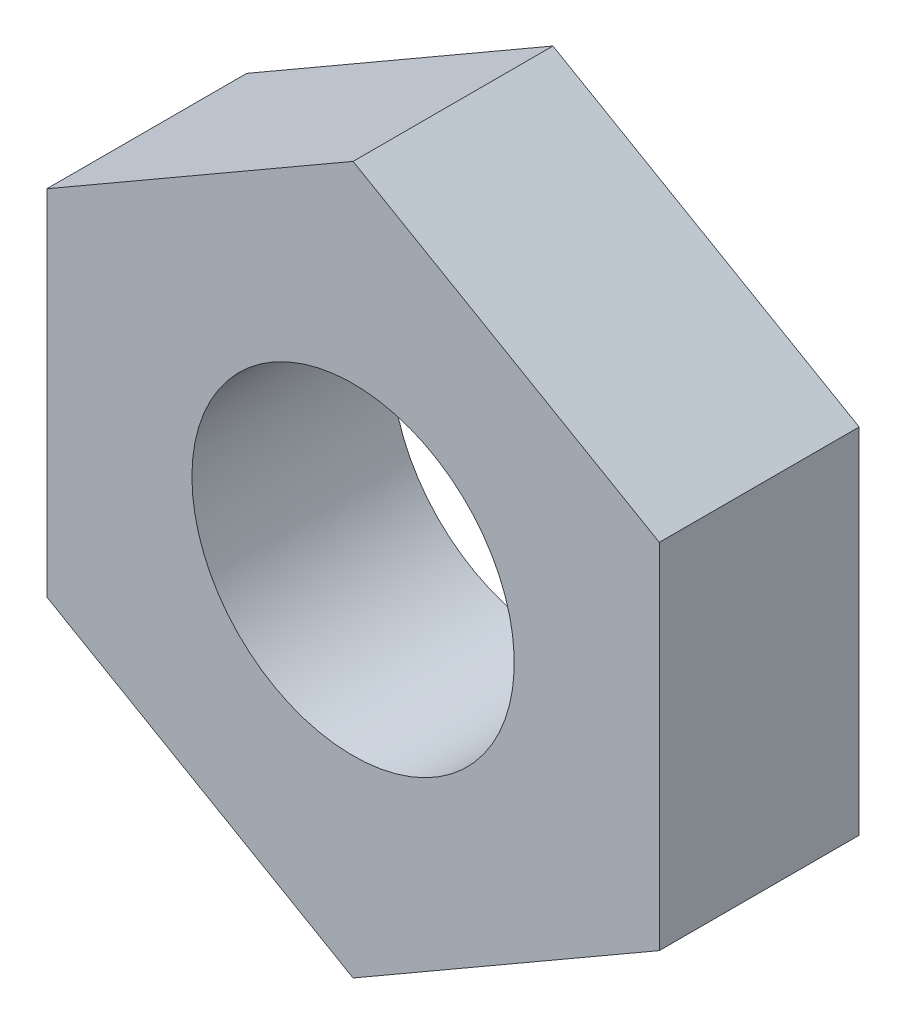
ISO-10303-21;
HEADER;
FILE_DESCRIPTION(('STEP AP214'),'2;1');
FILE_NAME('part.step','',(''),(''),'','','');
FILE_SCHEMA(('AUTOMOTIVE_DESIGN { 1 0 10303 214 1 1 1 1 }'));
ENDSEC;
DATA;
#1=APPLICATION_CONTEXT('core data for automotive mechanical design processes');
#2=APPLICATION_PROTOCOL_DEFINITION('international standard','automotive_design',2000,#1);
#3=PRODUCT_CONTEXT('',#1,'mechanical');
#4=PRODUCT('Part','Part','',(#3));
#5=PRODUCT_RELATED_PRODUCT_CATEGORY('part','',(#4));
#6=PRODUCT_DEFINITION_FORMATION('','',#4);
#7=PRODUCT_DEFINITION_CONTEXT('part definition',#1,'design');
#8=PRODUCT_DEFINITION('design','',#6,#7);
#9=PRODUCT_DEFINITION_SHAPE('','',#8);
#10=(LENGTH_UNIT() NAMED_UNIT(*) SI_UNIT(.MILLI.,.METRE.));
#11=(NAMED_UNIT(*) PLANE_ANGLE_UNIT() SI_UNIT($,.RADIAN.));
#12=(NAMED_UNIT(*) SI_UNIT($,.STERADIAN.) SOLID_ANGLE_UNIT());
#13=UNCERTAINTY_MEASURE_WITH_UNIT(LENGTH_MEASURE(1.E-05),#10,'distance_accuracy_value','');
#14=(GEOMETRIC_REPRESENTATION_CONTEXT(3) GLOBAL_UNCERTAINTY_ASSIGNED_CONTEXT((#13)) GLOBAL_UNIT_ASSIGNED_CONTEXT((#10,
#11,#12)) REPRESENTATION_CONTEXT('',''));
#15=CARTESIAN_POINT('',(0.,0.,0.));
#16=DIRECTION('',(0.,0.,1.));
#17=DIRECTION('',(1.,0.,0.));
#18=AXIS2_PLACEMENT_3D('',#15,#16,#17);
#19=CARTESIAN_POINT('',(0.,0.,3.1));
#20=DIRECTION('',(0.,0.,1.));
#21=DIRECTION('',(1.,0.,0.));
#22=AXIS2_PLACEMENT_3D('',#19,#20,#21);
#23=PLANE('',#22);
#24=DIRECTION('',(0.866025403784441,-0.499999999999996,0.));
#25=VECTOR('',#24,1.);
#26=CARTESIAN_POINT('',(15.25,-22.7424137786508,3.1));
#27=LINE('',#26,#25);
#28=CARTESIAN_POINT('',(15.25,-22.7424137786508,3.1));
#29=VERTEX_POINT('',#28);
#30=CARTESIAN_POINT('',(20.,-25.4848275573014,3.1));
#31=VERTEX_POINT('',#30);
#32=EDGE_CURVE('E134',#29,#31,#27,.T.);
#33=ORIENTED_EDGE('',*,*,#32,.T.);
#34=DIRECTION('',(0.866025403784438,0.500000000000001,0.));
#35=VECTOR('',#34,1.);
#36=CARTESIAN_POINT('',(20.,-25.4848275573014,3.1));
#37=LINE('',#36,#35);
#38=CARTESIAN_POINT('',(24.75,-22.7424137786507,3.1));
#39=VERTEX_POINT('',#38);
#40=EDGE_CURVE('E93',#31,#39,#37,.T.);
#41=ORIENTED_EDGE('',*,*,#40,.T.);
#42=DIRECTION('',(0.,1.,0.));
#43=VECTOR('',#42,1.);
#44=CARTESIAN_POINT('',(24.75,-22.7424137786507,3.1));
#45=LINE('',#44,#43);
#46=CARTESIAN_POINT('',(24.75,-17.2575862213493,3.1));
#47=VERTEX_POINT('',#46);
#48=EDGE_CURVE('E107',#39,#47,#45,.T.);
#49=ORIENTED_EDGE('',*,*,#48,.T.);
#50=DIRECTION('',(-0.866025403784441,0.499999999999996,0.));
#51=VECTOR('',#50,1.);
#52=CARTESIAN_POINT('',(24.75,-17.2575862213493,3.1));
#53=LINE('',#52,#51);
#54=CARTESIAN_POINT('',(20.,-14.5151724426986,3.1));
#55=VERTEX_POINT('',#54);
#56=EDGE_CURVE('E99',#47,#55,#53,.T.);
#57=ORIENTED_EDGE('',*,*,#56,.T.);
#58=DIRECTION('',(-0.866025403784435,-0.500000000000006,0.));
#59=VECTOR('',#58,1.);
#60=CARTESIAN_POINT('',(20.,-14.5151724426986,3.1));
#61=LINE('',#60,#59);
#62=CARTESIAN_POINT('',(15.25,-17.2575862213493,3.1));
#63=VERTEX_POINT('',#62);
#64=EDGE_CURVE('E101',#55,#63,#61,.T.);
#65=ORIENTED_EDGE('',*,*,#64,.T.);
#66=DIRECTION('',(0.,-1.,0.));
#67=VECTOR('',#66,1.);
#68=CARTESIAN_POINT('',(15.25,-17.2575862213493,3.1));
#69=LINE('',#68,#67);
#70=EDGE_CURVE('E57',#63,#29,#69,.T.);
#71=ORIENTED_EDGE('',*,*,#70,.T.);
#72=EDGE_LOOP('',(#33,#41,#49,#57,#65,#71));
#73=FACE_BOUND('',#72,.T.);
#74=CARTESIAN_POINT('',(20.,-20.,3.1));
#75=DIRECTION('',(0.,0.,1.));
#76=DIRECTION('',(1.,0.,0.));
#77=AXIS2_PLACEMENT_3D('',#74,#75,#76);
#78=CIRCLE('',#77,2.5);
#79=CARTESIAN_POINT('',(17.5,-20.,3.1));
#80=VERTEX_POINT('',#79);
#81=EDGE_CURVE('E126',#80,#80,#78,.T.);
#82=ORIENTED_EDGE('',*,*,#81,.F.);
#83=EDGE_LOOP('',(#82));
#84=FACE_BOUND('',#83,.T.);
#85=ADVANCED_FACE('F39',(#73,#84),#23,.T.);
#86=CARTESIAN_POINT('',(0.,0.,0.));
#87=DIRECTION('',(0.,0.,1.));
#88=DIRECTION('',(1.,0.,0.));
#89=AXIS2_PLACEMENT_3D('',#86,#87,#88);
#90=PLANE('',#89);
#91=DIRECTION('',(0.866025403784441,-0.499999999999996,0.));
#92=VECTOR('',#91,1.);
#93=CARTESIAN_POINT('',(15.25,-22.7424137786508,0.));
#94=LINE('',#93,#92);
#95=CARTESIAN_POINT('',(15.25,-22.7424137786508,0.));
#96=VERTEX_POINT('',#95);
#97=CARTESIAN_POINT('',(20.,-25.4848275573014,0.));
#98=VERTEX_POINT('',#97);
#99=EDGE_CURVE('E125',#96,#98,#94,.T.);
#100=ORIENTED_EDGE('',*,*,#99,.F.);
#101=DIRECTION('',(0.,-1.,0.));
#102=VECTOR('',#101,1.);
#103=CARTESIAN_POINT('',(15.25,-17.2575862213493,0.));
#104=LINE('',#103,#102);
#105=CARTESIAN_POINT('',(15.25,-17.2575862213493,0.));
#106=VERTEX_POINT('',#105);
#107=EDGE_CURVE('E82',#106,#96,#104,.T.);
#108=ORIENTED_EDGE('',*,*,#107,.F.);
#109=DIRECTION('',(-0.866025403784435,-0.500000000000006,0.));
#110=VECTOR('',#109,1.);
#111=CARTESIAN_POINT('',(20.,-14.5151724426986,0.));
#112=LINE('',#111,#110);
#113=CARTESIAN_POINT('',(20.,-14.5151724426986,0.));
#114=VERTEX_POINT('',#113);
#115=EDGE_CURVE('E80',#114,#106,#112,.T.);
#116=ORIENTED_EDGE('',*,*,#115,.F.);
#117=DIRECTION('',(-0.866025403784441,0.499999999999996,0.));
#118=VECTOR('',#117,1.);
#119=CARTESIAN_POINT('',(24.75,-17.2575862213493,0.));
#120=LINE('',#119,#118);
#121=CARTESIAN_POINT('',(24.75,-17.2575862213493,0.));
#122=VERTEX_POINT('',#121);
#123=EDGE_CURVE('E114',#122,#114,#120,.T.);
#124=ORIENTED_EDGE('',*,*,#123,.F.);
#125=DIRECTION('',(0.,1.,0.));
#126=VECTOR('',#125,1.);
#127=CARTESIAN_POINT('',(24.75,-22.7424137786507,0.));
#128=LINE('',#127,#126);
#129=CARTESIAN_POINT('',(24.75,-22.7424137786507,0.));
#130=VERTEX_POINT('',#129);
#131=EDGE_CURVE('E127',#130,#122,#128,.T.);
#132=ORIENTED_EDGE('',*,*,#131,.F.);
#133=DIRECTION('',(0.866025403784438,0.500000000000001,0.));
#134=VECTOR('',#133,1.);
#135=CARTESIAN_POINT('',(20.,-25.4848275573014,0.));
#136=LINE('',#135,#134);
#137=EDGE_CURVE('E130',#98,#130,#136,.T.);
#138=ORIENTED_EDGE('',*,*,#137,.F.);
#139=EDGE_LOOP('',(#100,#108,#116,#124,#132,#138));
#140=FACE_BOUND('',#139,.T.);
#141=CARTESIAN_POINT('',(20.,-20.,0.));
#142=DIRECTION('',(0.,0.,1.));
#143=DIRECTION('',(1.,0.,0.));
#144=AXIS2_PLACEMENT_3D('',#141,#142,#143);
#145=CIRCLE('',#144,2.5);
#146=CARTESIAN_POINT('',(17.5,-20.,0.));
#147=VERTEX_POINT('',#146);
#148=EDGE_CURVE('E228',#147,#147,#145,.T.);
#149=ORIENTED_EDGE('',*,*,#148,.T.);
#150=EDGE_LOOP('',(#149));
#151=FACE_BOUND('',#150,.T.);
#152=ADVANCED_FACE('F143',(#140,#151),#90,.F.);
#153=CARTESIAN_POINT('',(15.25,-22.7424137786508,3.1));
#154=DIRECTION('',(0.499999999999996,0.866025403784441,0.));
#155=DIRECTION('',(-0.866025403784441,0.499999999999996,0.));
#156=AXIS2_PLACEMENT_3D('',#153,#154,#155);
#157=PLANE('',#156);
#158=ORIENTED_EDGE('',*,*,#99,.T.);
#159=DIRECTION('',(0.,0.,-1.));
#160=VECTOR('',#159,1.);
#161=CARTESIAN_POINT('',(20.,-25.4848275573014,3.1));
#162=LINE('',#161,#160);
#163=EDGE_CURVE('E11',#31,#98,#162,.T.);
#164=ORIENTED_EDGE('',*,*,#163,.F.);
#165=ORIENTED_EDGE('',*,*,#32,.F.);
#166=DIRECTION('',(0.,0.,-1.));
#167=VECTOR('',#166,1.);
#168=CARTESIAN_POINT('',(15.25,-22.7424137786508,3.1));
#169=LINE('',#168,#167);
#170=EDGE_CURVE('E118',#29,#96,#169,.T.);
#171=ORIENTED_EDGE('',*,*,#170,.T.);
#172=EDGE_LOOP('',(#158,#164,#165,#171));
#173=FACE_BOUND('',#172,.T.);
#174=ADVANCED_FACE('F41',(#173),#157,.F.);
#175=CARTESIAN_POINT('',(20.,-25.4848275573014,3.1));
#176=DIRECTION('',(-0.500000000000001,0.866025403784438,0.));
#177=DIRECTION('',(-0.866025403784438,-0.500000000000001,0.));
#178=AXIS2_PLACEMENT_3D('',#175,#176,#177);
#179=PLANE('',#178);
#180=ORIENTED_EDGE('',*,*,#137,.T.);
#181=DIRECTION('',(0.,0.,-1.));
#182=VECTOR('',#181,1.);
#183=CARTESIAN_POINT('',(24.75,-22.7424137786507,3.1));
#184=LINE('',#183,#182);
#185=EDGE_CURVE('E48',#39,#130,#184,.T.);
#186=ORIENTED_EDGE('',*,*,#185,.F.);
#187=ORIENTED_EDGE('',*,*,#40,.F.);
#188=ORIENTED_EDGE('',*,*,#163,.T.);
#189=EDGE_LOOP('',(#180,#186,#187,#188));
#190=FACE_BOUND('',#189,.T.);
#191=ADVANCED_FACE('F170',(#190),#179,.F.);
#192=CARTESIAN_POINT('',(24.75,-22.7424137786507,3.1));
#193=DIRECTION('',(-1.,0.,0.));
#194=DIRECTION('',(0.,-1.,0.));
#195=AXIS2_PLACEMENT_3D('',#192,#193,#194);
#196=PLANE('',#195);
#197=ORIENTED_EDGE('',*,*,#131,.T.);
#198=DIRECTION('',(0.,0.,-1.));
#199=VECTOR('',#198,1.);
#200=CARTESIAN_POINT('',(24.75,-17.2575862213493,3.1));
#201=LINE('',#200,#199);
#202=EDGE_CURVE('E113',#47,#122,#201,.T.);
#203=ORIENTED_EDGE('',*,*,#202,.F.);
#204=ORIENTED_EDGE('',*,*,#48,.F.);
#205=ORIENTED_EDGE('',*,*,#185,.T.);
#206=EDGE_LOOP('',(#197,#203,#204,#205));
#207=FACE_BOUND('',#206,.T.);
#208=ADVANCED_FACE('F141',(#207),#196,.F.);
#209=CARTESIAN_POINT('',(24.75,-17.2575862213493,3.1));
#210=DIRECTION('',(-0.499999999999996,-0.866025403784441,0.));
#211=DIRECTION('',(0.866025403784441,-0.499999999999996,0.));
#212=AXIS2_PLACEMENT_3D('',#209,#210,#211);
#213=PLANE('',#212);
#214=ORIENTED_EDGE('',*,*,#123,.T.);
#215=DIRECTION('',(0.,0.,-1.));
#216=VECTOR('',#215,1.);
#217=CARTESIAN_POINT('',(20.,-14.5151724426986,3.1));
#218=LINE('',#217,#216);
#219=EDGE_CURVE('E112',#55,#114,#218,.T.);
#220=ORIENTED_EDGE('',*,*,#219,.F.);
#221=ORIENTED_EDGE('',*,*,#56,.F.);
#222=ORIENTED_EDGE('',*,*,#202,.T.);
#223=EDGE_LOOP('',(#214,#220,#221,#222));
#224=FACE_BOUND('',#223,.T.);
#225=ADVANCED_FACE('F115',(#224),#213,.F.);
#226=CARTESIAN_POINT('',(20.,-14.5151724426986,3.1));
#227=DIRECTION('',(0.500000000000006,-0.866025403784435,0.));
#228=DIRECTION('',(0.866025403784435,0.500000000000006,0.));
#229=AXIS2_PLACEMENT_3D('',#226,#227,#228);
#230=PLANE('',#229);
#231=ORIENTED_EDGE('',*,*,#115,.T.);
#232=DIRECTION('',(0.,0.,-1.));
#233=VECTOR('',#232,1.);
#234=CARTESIAN_POINT('',(15.25,-17.2575862213493,3.1));
#235=LINE('',#234,#233);
#236=EDGE_CURVE('E117',#63,#106,#235,.T.);
#237=ORIENTED_EDGE('',*,*,#236,.F.);
#238=ORIENTED_EDGE('',*,*,#64,.F.);
#239=ORIENTED_EDGE('',*,*,#219,.T.);
#240=EDGE_LOOP('',(#231,#237,#238,#239));
#241=FACE_BOUND('',#240,.T.);
#242=ADVANCED_FACE('F120',(#241),#230,.F.);
#243=CARTESIAN_POINT('',(15.25,-17.2575862213493,3.1));
#244=DIRECTION('',(1.,0.,0.));
#245=DIRECTION('',(0.,1.,0.));
#246=AXIS2_PLACEMENT_3D('',#243,#244,#245);
#247=PLANE('',#246);
#248=ORIENTED_EDGE('',*,*,#107,.T.);
#249=ORIENTED_EDGE('',*,*,#170,.F.);
#250=ORIENTED_EDGE('',*,*,#70,.F.);
#251=ORIENTED_EDGE('',*,*,#236,.T.);
#252=EDGE_LOOP('',(#248,#249,#250,#251));
#253=FACE_BOUND('',#252,.T.);
#254=ADVANCED_FACE('F146',(#253),#247,.F.);
#255=CARTESIAN_POINT('',(20.,-20.,3.1));
#256=DIRECTION('',(0.,0.,-1.));
#257=DIRECTION('',(-1.,0.,0.));
#258=AXIS2_PLACEMENT_3D('',#255,#256,#257);
#259=CYLINDRICAL_SURFACE('',#258,2.5);
#260=CARTESIAN_POINT('',(17.5,-20.,3.1));
#261=CARTESIAN_POINT('',(17.5,-20.,3.06770833333333));
#262=CARTESIAN_POINT('',(17.5,-20.,3.03541666666667));
#263=CARTESIAN_POINT('',(17.5,-20.,2.97083333333333));
#264=CARTESIAN_POINT('',(17.5,-20.,2.93854166666667));
#265=CARTESIAN_POINT('',(17.5,-20.,2.87395833333333));
#266=CARTESIAN_POINT('',(17.5,-20.,2.84166666666667));
#267=CARTESIAN_POINT('',(17.5,-20.,2.77708333333333));
#268=CARTESIAN_POINT('',(17.5,-20.,2.74479166666667));
#269=CARTESIAN_POINT('',(17.5,-20.,2.68020833333333));
#270=CARTESIAN_POINT('',(17.5,-20.,2.64791666666667));
#271=CARTESIAN_POINT('',(17.5,-20.,2.58333333333333));
#272=CARTESIAN_POINT('',(17.5,-20.,2.55104166666667));
#273=CARTESIAN_POINT('',(17.5,-20.,2.48645833333333));
#274=CARTESIAN_POINT('',(17.5,-20.,2.45416666666667));
#275=CARTESIAN_POINT('',(17.5,-20.,2.38958333333333));
#276=CARTESIAN_POINT('',(17.5,-20.,2.35729166666667));
#277=CARTESIAN_POINT('',(17.5,-20.,2.29270833333333));
#278=CARTESIAN_POINT('',(17.5,-20.,2.26041666666667));
#279=CARTESIAN_POINT('',(17.5,-20.,2.19583333333333));
#280=CARTESIAN_POINT('',(17.5,-20.,2.16354166666667));
#281=CARTESIAN_POINT('',(17.5,-20.,2.09895833333333));
#282=CARTESIAN_POINT('',(17.5,-20.,2.06666666666667));
#283=CARTESIAN_POINT('',(17.5,-20.,2.00208333333333));
#284=CARTESIAN_POINT('',(17.5,-20.,1.96979166666667));
#285=CARTESIAN_POINT('',(17.5,-20.,1.90520833333333));
#286=CARTESIAN_POINT('',(17.5,-20.,1.87291666666667));
#287=CARTESIAN_POINT('',(17.5,-20.,1.80833333333333));
#288=CARTESIAN_POINT('',(17.5,-20.,1.77604166666667));
#289=CARTESIAN_POINT('',(17.5,-20.,1.71145833333333));
#290=CARTESIAN_POINT('',(17.5,-20.,1.67916666666667));
#291=CARTESIAN_POINT('',(17.5,-20.,1.61458333333333));
#292=CARTESIAN_POINT('',(17.5,-20.,1.58229166666667));
#293=CARTESIAN_POINT('',(17.5,-20.,1.51770833333333));
#294=CARTESIAN_POINT('',(17.5,-20.,1.48541666666667));
#295=CARTESIAN_POINT('',(17.5,-20.,1.42083333333333));
#296=CARTESIAN_POINT('',(17.5,-20.,1.38854166666667));
#297=CARTESIAN_POINT('',(17.5,-20.,1.32395833333333));
#298=CARTESIAN_POINT('',(17.5,-20.,1.29166666666667));
#299=CARTESIAN_POINT('',(17.5,-20.,1.22708333333333));
#300=CARTESIAN_POINT('',(17.5,-20.,1.19479166666667));
#301=CARTESIAN_POINT('',(17.5,-20.,1.13020833333333));
#302=CARTESIAN_POINT('',(17.5,-20.,1.09791666666667));
#303=CARTESIAN_POINT('',(17.5,-20.,1.03333333333333));
#304=CARTESIAN_POINT('',(17.5,-20.,1.00104166666667));
#305=CARTESIAN_POINT('',(17.5,-20.,0.936458333333333));
#306=CARTESIAN_POINT('',(17.5,-20.,0.904166666666667));
#307=CARTESIAN_POINT('',(17.5,-20.,0.839583333333333));
#308=CARTESIAN_POINT('',(17.5,-20.,0.807291666666667));
#309=CARTESIAN_POINT('',(17.5,-20.,0.742708333333333));
#310=CARTESIAN_POINT('',(17.5,-20.,0.710416666666667));
#311=CARTESIAN_POINT('',(17.5,-20.,0.645833333333333));
#312=CARTESIAN_POINT('',(17.5,-20.,0.613541666666667));
#313=CARTESIAN_POINT('',(17.5,-20.,0.548958333333333));
#314=CARTESIAN_POINT('',(17.5,-20.,0.516666666666667));
#315=CARTESIAN_POINT('',(17.5,-20.,0.452083333333333));
#316=CARTESIAN_POINT('',(17.5,-20.,0.419791666666667));
#317=CARTESIAN_POINT('',(17.5,-20.,0.355208333333333));
#318=CARTESIAN_POINT('',(17.5,-20.,0.322916666666667));
#319=CARTESIAN_POINT('',(17.5,-20.,0.258333333333333));
#320=CARTESIAN_POINT('',(17.5,-20.,0.226041666666667));
#321=CARTESIAN_POINT('',(17.5,-20.,0.161458333333333));
#322=CARTESIAN_POINT('',(17.5,-20.,0.129166666666667));
#323=CARTESIAN_POINT('',(17.5,-20.,0.0645833333333335));
#324=CARTESIAN_POINT('',(17.5,-20.,0.0322916666666667));
#325=CARTESIAN_POINT('',(17.5,-20.,0.));
#326=B_SPLINE_CURVE_WITH_KNOTS('',3,(#260,#261,#262,#263,#264,#265,#266,#267,#268,#269,#270,
#271,#272,#273,#274,#275,#276,#277,#278,#279,#280,#281,#282,#283,#284,#285,#286,#287,#288,#289,
#290,#291,#292,#293,#294,#295,#296,#297,#298,#299,#300,#301,#302,#303,#304,#305,#306,#307,#308,
#309,#310,#311,#312,#313,#314,#315,#316,#317,#318,#319,#320,#321,#322,#323,#324,#325),
.UNSPECIFIED.,.F.,.F.,(4,2,2,2,2,2,2,2,2,2,2,2,2,2,2,2,2,2,2,2,2,2,2,2,2,2,2,2,2,2,2,2,4),(0.,
0.0968749999999997,0.19375,0.290625,0.3875,0.484375,0.58125,0.678125,0.775,0.871874999999999,
0.96875,1.065625,1.1625,1.259375,1.35625,1.453125,1.55,1.646875,1.74375,1.840625,1.9375,
2.034375,2.13125,2.228125,2.325,2.421875,2.51875,2.615625,2.7125,2.809375,2.90625,3.003125,3.1),.UNSPECIFIED.);
#327=EDGE_CURVE('BSEAM152',#80,#147,#326,.T.);
#328=ORIENTED_EDGE('',*,*,#81,.T.);
#329=ORIENTED_EDGE('',*,*,#148,.F.);
#330=ORIENTED_EDGE('',*,*,#327,.T.);
#331=ORIENTED_EDGE('',*,*,#327,.F.);
#332=EDGE_LOOP('',(#328,#330,#329,#331));
#333=FACE_BOUND('',#332,.T.);
#334=ADVANCED_FACE('F152',(#333),#259,.F.);
#335=CLOSED_SHELL('',(#85,#152,#174,#191,#208,#225,#242,#254,#334));
#336=MANIFOLD_SOLID_BREP('B2',#335);
#337=ADVANCED_BREP_SHAPE_REPRESENTATION('',(#18,#336),#14);
#338=SHAPE_DEFINITION_REPRESENTATION(#9,#337);
ENDSEC;
END-ISO-10303-21;
